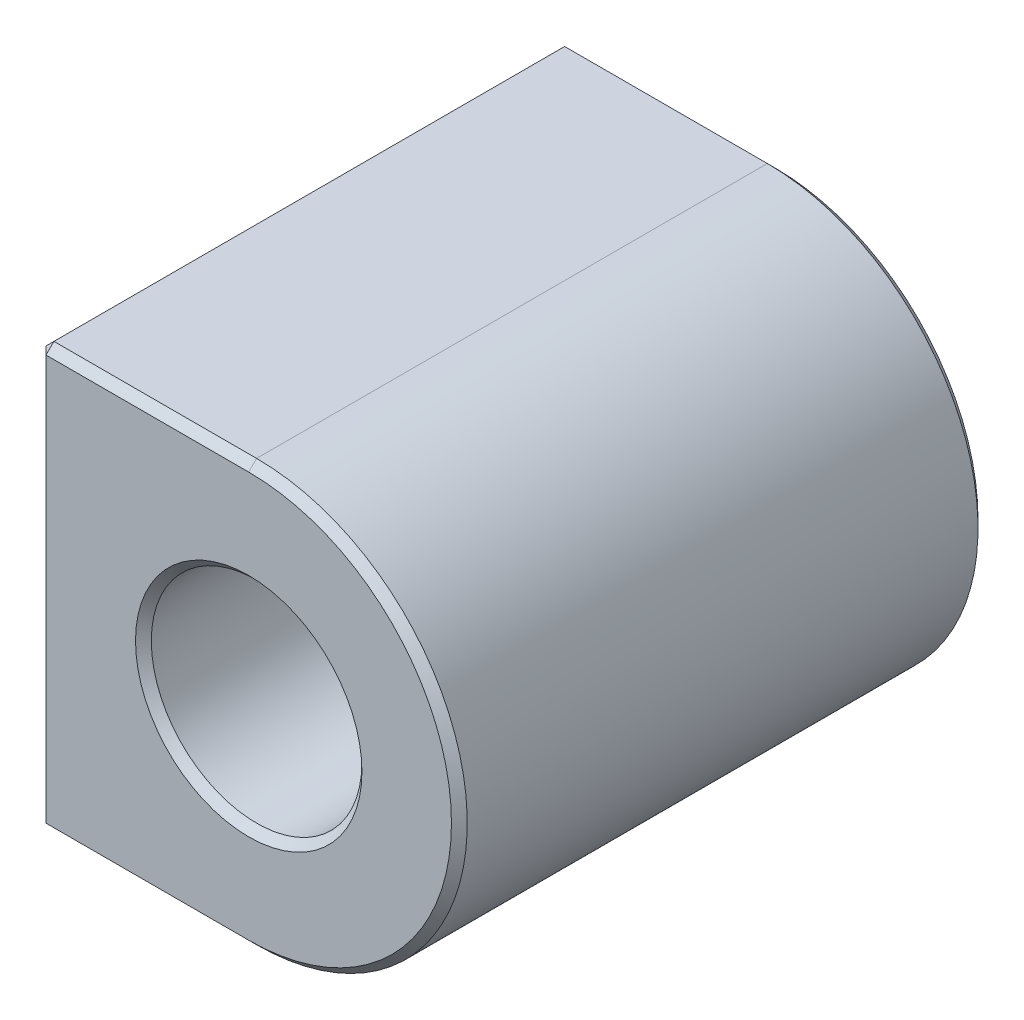
ISO-10303-21;
HEADER;
FILE_DESCRIPTION(('STEP AP214'),'2;1');
FILE_NAME('part.step','',(''),(''),'','','');
FILE_SCHEMA(('AUTOMOTIVE_DESIGN { 1 0 10303 214 1 1 1 1 }'));
ENDSEC;
DATA;
#1=APPLICATION_CONTEXT('core data for automotive mechanical design processes');
#2=APPLICATION_PROTOCOL_DEFINITION('international standard','automotive_design',2000,#1);
#3=PRODUCT_CONTEXT('',#1,'mechanical');
#4=PRODUCT('Part','Part','',(#3));
#5=PRODUCT_RELATED_PRODUCT_CATEGORY('part','',(#4));
#6=PRODUCT_DEFINITION_FORMATION('','',#4);
#7=PRODUCT_DEFINITION_CONTEXT('part definition',#1,'design');
#8=PRODUCT_DEFINITION('design','',#6,#7);
#9=PRODUCT_DEFINITION_SHAPE('','',#8);
#10=(LENGTH_UNIT() NAMED_UNIT(*) SI_UNIT(.MILLI.,.METRE.));
#11=(NAMED_UNIT(*) PLANE_ANGLE_UNIT() SI_UNIT($,.RADIAN.));
#12=(NAMED_UNIT(*) SI_UNIT($,.STERADIAN.) SOLID_ANGLE_UNIT());
#13=UNCERTAINTY_MEASURE_WITH_UNIT(LENGTH_MEASURE(1.E-05),#10,'distance_accuracy_value','');
#14=(GEOMETRIC_REPRESENTATION_CONTEXT(3) GLOBAL_UNCERTAINTY_ASSIGNED_CONTEXT((#13)) GLOBAL_UNIT_ASSIGNED_CONTEXT((#10,
#11,#12)) REPRESENTATION_CONTEXT('',''));
#15=CARTESIAN_POINT('',(0.,0.,0.));
#16=DIRECTION('',(0.,0.,1.));
#17=DIRECTION('',(1.,0.,0.));
#18=AXIS2_PLACEMENT_3D('',#15,#16,#17);
#19=CARTESIAN_POINT('',(0.,0.,5.));
#20=DIRECTION('',(0.,0.,1.));
#21=DIRECTION('',(1.,0.,0.));
#22=AXIS2_PLACEMENT_3D('',#19,#20,#21);
#23=PLANE('',#22);
#24=CARTESIAN_POINT('',(0.,0.,5.));
#25=DIRECTION('',(0.,0.,1.));
#26=DIRECTION('',(1.,0.,0.));
#27=AXIS2_PLACEMENT_3D('',#24,#25,#26);
#28=CIRCLE('',#27,2.15);
#29=CARTESIAN_POINT('',(2.15,0.,5.));
#30=VERTEX_POINT('',#29);
#31=EDGE_CURVE('E236',#30,#30,#28,.F.);
#32=ORIENTED_EDGE('',*,*,#31,.T.);
#33=EDGE_LOOP('',(#32));
#34=FACE_BOUND('',#33,.T.);
#35=DIRECTION('',(1.,0.,0.));
#36=VECTOR('',#35,1.);
#37=CARTESIAN_POINT('',(0.,-3.85,5.));
#38=LINE('',#37,#36);
#39=CARTESIAN_POINT('',(-3.85,-3.85,5.));
#40=VERTEX_POINT('',#39);
#41=CARTESIAN_POINT('',(0.,-3.85,5.));
#42=VERTEX_POINT('',#41);
#43=EDGE_CURVE('E133',#40,#42,#38,.T.);
#44=ORIENTED_EDGE('',*,*,#43,.T.);
#45=CARTESIAN_POINT('',(0.,0.,5.));
#46=DIRECTION('',(0.,0.,1.));
#47=DIRECTION('',(1.,0.,0.));
#48=AXIS2_PLACEMENT_3D('',#45,#46,#47);
#49=CIRCLE('',#48,3.85);
#50=CARTESIAN_POINT('',(0.,3.85,5.));
#51=VERTEX_POINT('',#50);
#52=EDGE_CURVE('E128',#42,#51,#49,.T.);
#53=ORIENTED_EDGE('',*,*,#52,.T.);
#54=DIRECTION('',(-1.,0.,0.));
#55=VECTOR('',#54,1.);
#56=CARTESIAN_POINT('',(-4.,3.85,5.));
#57=LINE('',#56,#55);
#58=CARTESIAN_POINT('',(-3.85,3.85,5.));
#59=VERTEX_POINT('',#58);
#60=EDGE_CURVE('E123',#51,#59,#57,.T.);
#61=ORIENTED_EDGE('',*,*,#60,.T.);
#62=DIRECTION('',(0.,-1.,0.));
#63=VECTOR('',#62,1.);
#64=CARTESIAN_POINT('',(-3.85,-4.,5.));
#65=LINE('',#64,#63);
#66=EDGE_CURVE('E125',#59,#40,#65,.T.);
#67=ORIENTED_EDGE('',*,*,#66,.T.);
#68=EDGE_LOOP('',(#44,#53,#61,#67));
#69=FACE_BOUND('',#68,.T.);
#70=ADVANCED_FACE('F45',(#34,#69),#23,.T.);
#71=CARTESIAN_POINT('',(0.,0.,-5.));
#72=DIRECTION('',(0.,0.,1.));
#73=DIRECTION('',(1.,0.,0.));
#74=AXIS2_PLACEMENT_3D('',#71,#72,#73);
#75=PLANE('',#74);
#76=CARTESIAN_POINT('',(0.,0.,-5.));
#77=DIRECTION('',(0.,0.,1.));
#78=DIRECTION('',(1.,0.,0.));
#79=AXIS2_PLACEMENT_3D('',#76,#77,#78);
#80=CIRCLE('',#79,2.15);
#81=CARTESIAN_POINT('',(2.15,0.,-5.));
#82=VERTEX_POINT('',#81);
#83=EDGE_CURVE('E253',#82,#82,#80,.T.);
#84=ORIENTED_EDGE('',*,*,#83,.T.);
#85=EDGE_LOOP('',(#84));
#86=FACE_BOUND('',#85,.T.);
#87=DIRECTION('',(1.,0.,0.));
#88=VECTOR('',#87,1.);
#89=CARTESIAN_POINT('',(0.,3.85,-5.));
#90=LINE('',#89,#88);
#91=CARTESIAN_POINT('',(-3.85,3.85,-5.));
#92=VERTEX_POINT('',#91);
#93=CARTESIAN_POINT('',(0.,3.85,-5.));
#94=VERTEX_POINT('',#93);
#95=EDGE_CURVE('E243',#92,#94,#90,.T.);
#96=ORIENTED_EDGE('',*,*,#95,.T.);
#97=CARTESIAN_POINT('',(0.,0.,-5.));
#98=DIRECTION('',(0.,0.,1.));
#99=DIRECTION('',(1.,0.,0.));
#100=AXIS2_PLACEMENT_3D('',#97,#98,#99);
#101=CIRCLE('',#100,3.85);
#102=CARTESIAN_POINT('',(0.,-3.85,-5.));
#103=VERTEX_POINT('',#102);
#104=EDGE_CURVE('E249',#94,#103,#101,.F.);
#105=ORIENTED_EDGE('',*,*,#104,.T.);
#106=DIRECTION('',(-1.,0.,0.));
#107=VECTOR('',#106,1.);
#108=CARTESIAN_POINT('',(0.,-3.85,-5.));
#109=LINE('',#108,#107);
#110=CARTESIAN_POINT('',(-3.85,-3.85,-5.));
#111=VERTEX_POINT('',#110);
#112=EDGE_CURVE('E246',#103,#111,#109,.T.);
#113=ORIENTED_EDGE('',*,*,#112,.T.);
#114=DIRECTION('',(0.,1.,0.));
#115=VECTOR('',#114,1.);
#116=CARTESIAN_POINT('',(-3.85,0.,-5.));
#117=LINE('',#116,#115);
#118=EDGE_CURVE('E240',#111,#92,#117,.T.);
#119=ORIENTED_EDGE('',*,*,#118,.T.);
#120=EDGE_LOOP('',(#96,#105,#113,#119));
#121=FACE_BOUND('',#120,.T.);
#122=ADVANCED_FACE('F321',(#86,#121),#75,.F.);
#123=CARTESIAN_POINT('',(0.,0.,5.));
#124=DIRECTION('',(0.,0.,-1.));
#125=DIRECTION('',(-1.,0.,0.));
#126=AXIS2_PLACEMENT_3D('',#123,#124,#125);
#127=CYLINDRICAL_SURFACE('',#126,4.);
#128=DIRECTION('',(0.,0.,-1.));
#129=VECTOR('',#128,1.);
#130=CARTESIAN_POINT('',(0.,4.,5.));
#131=LINE('',#130,#129);
#132=CARTESIAN_POINT('',(0.,4.,4.85));
#133=VERTEX_POINT('',#132);
#134=CARTESIAN_POINT('',(0.,4.,-4.85));
#135=VERTEX_POINT('',#134);
#136=EDGE_CURVE('E215',#133,#135,#131,.T.);
#137=ORIENTED_EDGE('',*,*,#136,.F.);
#138=CARTESIAN_POINT('',(0.,0.,4.85));
#139=DIRECTION('',(0.,0.,1.));
#140=DIRECTION('',(1.,0.,0.));
#141=AXIS2_PLACEMENT_3D('',#138,#139,#140);
#142=CIRCLE('',#141,4.);
#143=CARTESIAN_POINT('',(0.,-4.,4.85));
#144=VERTEX_POINT('',#143);
#145=EDGE_CURVE('E260',#133,#144,#142,.F.);
#146=ORIENTED_EDGE('',*,*,#145,.T.);
#147=DIRECTION('',(0.,0.,-1.));
#148=VECTOR('',#147,1.);
#149=CARTESIAN_POINT('',(0.,-4.,5.));
#150=LINE('',#149,#148);
#151=CARTESIAN_POINT('',(0.,-4.,-4.85));
#152=VERTEX_POINT('',#151);
#153=EDGE_CURVE('E209',#144,#152,#150,.T.);
#154=ORIENTED_EDGE('',*,*,#153,.T.);
#155=CARTESIAN_POINT('',(0.,0.,-4.85));
#156=DIRECTION('',(0.,0.,1.));
#157=DIRECTION('',(1.,0.,0.));
#158=AXIS2_PLACEMENT_3D('',#155,#156,#157);
#159=CIRCLE('',#158,4.);
#160=EDGE_CURVE('E257',#152,#135,#159,.T.);
#161=ORIENTED_EDGE('',*,*,#160,.T.);
#162=EDGE_LOOP('',(#137,#146,#154,#161));
#163=FACE_BOUND('',#162,.T.);
#164=ADVANCED_FACE('F293',(#163),#127,.T.);
#165=CARTESIAN_POINT('',(0.,4.,5.));
#166=DIRECTION('',(0.,-1.,0.));
#167=DIRECTION('',(1.,0.,0.));
#168=AXIS2_PLACEMENT_3D('',#165,#166,#167);
#169=PLANE('',#168);
#170=DIRECTION('',(0.,0.,1.));
#171=VECTOR('',#170,1.);
#172=CARTESIAN_POINT('',(-3.85,4.,5.));
#173=LINE('',#172,#171);
#174=CARTESIAN_POINT('',(-3.85,4.,-4.85));
#175=VERTEX_POINT('',#174);
#176=CARTESIAN_POINT('',(-3.85,4.,4.85));
#177=VERTEX_POINT('',#176);
#178=EDGE_CURVE('E272',#175,#177,#173,.T.);
#179=ORIENTED_EDGE('',*,*,#178,.T.);
#180=DIRECTION('',(1.,0.,0.));
#181=VECTOR('',#180,1.);
#182=CARTESIAN_POINT('',(0.,4.,4.85));
#183=LINE('',#182,#181);
#184=EDGE_CURVE('E157',#177,#133,#183,.T.);
#185=ORIENTED_EDGE('',*,*,#184,.T.);
#186=ORIENTED_EDGE('',*,*,#136,.T.);
#187=DIRECTION('',(-1.,0.,0.));
#188=VECTOR('',#187,1.);
#189=CARTESIAN_POINT('',(0.,4.,-4.85));
#190=LINE('',#189,#188);
#191=EDGE_CURVE('E275',#135,#175,#190,.T.);
#192=ORIENTED_EDGE('',*,*,#191,.T.);
#193=EDGE_LOOP('',(#179,#185,#186,#192));
#194=FACE_BOUND('',#193,.T.);
#195=ADVANCED_FACE('F337',(#194),#169,.F.);
#196=CARTESIAN_POINT('',(-4.,4.,5.));
#197=DIRECTION('',(1.,0.,0.));
#198=DIRECTION('',(0.,1.,0.));
#199=AXIS2_PLACEMENT_3D('',#196,#197,#198);
#200=PLANE('',#199);
#201=DIRECTION('',(0.,1.,0.));
#202=VECTOR('',#201,1.);
#203=CARTESIAN_POINT('',(-4.,4.,4.85));
#204=LINE('',#203,#202);
#205=CARTESIAN_POINT('',(-4.,-3.85,4.85));
#206=VERTEX_POINT('',#205);
#207=CARTESIAN_POINT('',(-4.,3.85,4.85));
#208=VERTEX_POINT('',#207);
#209=EDGE_CURVE('E56',#206,#208,#204,.T.);
#210=ORIENTED_EDGE('',*,*,#209,.T.);
#211=DIRECTION('',(0.,0.,-1.));
#212=VECTOR('',#211,1.);
#213=CARTESIAN_POINT('',(-4.,3.85,5.));
#214=LINE('',#213,#212);
#215=CARTESIAN_POINT('',(-4.,3.85,-4.85));
#216=VERTEX_POINT('',#215);
#217=EDGE_CURVE('E11',#208,#216,#214,.T.);
#218=ORIENTED_EDGE('',*,*,#217,.T.);
#219=DIRECTION('',(0.,-1.,0.));
#220=VECTOR('',#219,1.);
#221=CARTESIAN_POINT('',(-4.,4.,-4.85));
#222=LINE('',#221,#220);
#223=CARTESIAN_POINT('',(-4.,-3.85,-4.85));
#224=VERTEX_POINT('',#223);
#225=EDGE_CURVE('E280',#216,#224,#222,.T.);
#226=ORIENTED_EDGE('',*,*,#225,.T.);
#227=DIRECTION('',(0.,0.,1.));
#228=VECTOR('',#227,1.);
#229=CARTESIAN_POINT('',(-4.,-3.85,5.));
#230=LINE('',#229,#228);
#231=EDGE_CURVE('E67',#224,#206,#230,.T.);
#232=ORIENTED_EDGE('',*,*,#231,.T.);
#233=EDGE_LOOP('',(#210,#218,#226,#232));
#234=FACE_BOUND('',#233,.T.);
#235=ADVANCED_FACE('F334',(#234),#200,.F.);
#236=CARTESIAN_POINT('',(0.,-4.,5.));
#237=DIRECTION('',(0.,1.,0.));
#238=DIRECTION('',(-1.,0.,0.));
#239=AXIS2_PLACEMENT_3D('',#236,#237,#238);
#240=PLANE('',#239);
#241=ORIENTED_EDGE('',*,*,#153,.F.);
#242=DIRECTION('',(-1.,0.,0.));
#243=VECTOR('',#242,1.);
#244=CARTESIAN_POINT('',(-4.,-4.,4.85));
#245=LINE('',#244,#243);
#246=CARTESIAN_POINT('',(-3.85,-4.,4.85));
#247=VERTEX_POINT('',#246);
#248=EDGE_CURVE('E269',#144,#247,#245,.T.);
#249=ORIENTED_EDGE('',*,*,#248,.T.);
#250=DIRECTION('',(0.,0.,-1.));
#251=VECTOR('',#250,1.);
#252=CARTESIAN_POINT('',(-3.85,-4.,5.));
#253=LINE('',#252,#251);
#254=CARTESIAN_POINT('',(-3.85,-4.,-4.85));
#255=VERTEX_POINT('',#254);
#256=EDGE_CURVE('E263',#247,#255,#253,.T.);
#257=ORIENTED_EDGE('',*,*,#256,.T.);
#258=DIRECTION('',(1.,0.,0.));
#259=VECTOR('',#258,1.);
#260=CARTESIAN_POINT('',(0.,-4.,-4.85));
#261=LINE('',#260,#259);
#262=EDGE_CURVE('E266',#255,#152,#261,.T.);
#263=ORIENTED_EDGE('',*,*,#262,.T.);
#264=EDGE_LOOP('',(#241,#249,#257,#263));
#265=FACE_BOUND('',#264,.T.);
#266=ADVANCED_FACE('F295',(#265),#240,.F.);
#267=CARTESIAN_POINT('',(0.,0.,5.));
#268=DIRECTION('',(0.,0.,-1.));
#269=DIRECTION('',(-1.,0.,0.));
#270=AXIS2_PLACEMENT_3D('',#267,#268,#269);
#271=CYLINDRICAL_SURFACE('',#270,2.);
#272=CARTESIAN_POINT('',(0.,0.,4.85));
#273=DIRECTION('',(0.,0.,1.));
#274=DIRECTION('',(1.,0.,0.));
#275=AXIS2_PLACEMENT_3D('',#272,#273,#274);
#276=CIRCLE('',#275,2.);
#277=CARTESIAN_POINT('',(2.,0.,4.85));
#278=VERTEX_POINT('',#277);
#279=EDGE_CURVE('E145',#278,#278,#276,.T.);
#280=ORIENTED_EDGE('',*,*,#279,.T.);
#281=EDGE_LOOP('',(#280));
#282=FACE_BOUND('',#281,.T.);
#283=CARTESIAN_POINT('',(0.,0.,-4.85));
#284=DIRECTION('',(0.,0.,1.));
#285=DIRECTION('',(1.,0.,0.));
#286=AXIS2_PLACEMENT_3D('',#283,#284,#285);
#287=CIRCLE('',#286,2.);
#288=CARTESIAN_POINT('',(2.,0.,-4.85));
#289=VERTEX_POINT('',#288);
#290=EDGE_CURVE('E223',#289,#289,#287,.F.);
#291=ORIENTED_EDGE('',*,*,#290,.T.);
#292=EDGE_LOOP('',(#291));
#293=FACE_BOUND('',#292,.T.);
#294=ADVANCED_FACE('F330',(#282,#293),#271,.F.);
#295=CARTESIAN_POINT('',(0.,0.,4.85));
#296=DIRECTION('',(0.,0.,1.));
#297=DIRECTION('',(1.,0.,0.));
#298=AXIS2_PLACEMENT_3D('',#295,#296,#297);
#299=CONICAL_SURFACE('',#298,2.,0.785398163397451);
#300=ORIENTED_EDGE('',*,*,#31,.F.);
#301=EDGE_LOOP('',(#300));
#302=FACE_BOUND('',#301,.T.);
#303=ORIENTED_EDGE('',*,*,#279,.F.);
#304=EDGE_LOOP('',(#303));
#305=FACE_BOUND('',#304,.T.);
#306=ADVANCED_FACE('F344',(#302,#305),#299,.F.);
#307=CARTESIAN_POINT('',(0.,0.,-5.));
#308=DIRECTION('',(0.,0.,-1.));
#309=DIRECTION('',(-1.,0.,0.));
#310=AXIS2_PLACEMENT_3D('',#307,#308,#309);
#311=CONICAL_SURFACE('',#310,2.15,0.785398163397448);
#312=ORIENTED_EDGE('',*,*,#290,.F.);
#313=EDGE_LOOP('',(#312));
#314=FACE_BOUND('',#313,.T.);
#315=ORIENTED_EDGE('',*,*,#83,.F.);
#316=EDGE_LOOP('',(#315));
#317=FACE_BOUND('',#316,.T.);
#318=ADVANCED_FACE('F350',(#314,#317),#311,.F.);
#319=CARTESIAN_POINT('',(0.,0.,-4.85));
#320=DIRECTION('',(0.,0.,1.));
#321=DIRECTION('',(1.,0.,0.));
#322=AXIS2_PLACEMENT_3D('',#319,#320,#321);
#323=CONICAL_SURFACE('',#322,4.,0.785398163397454);
#324=DIRECTION('',(0.,-0.707106781186552,-0.707106781186543));
#325=VECTOR('',#324,1.);
#326=CARTESIAN_POINT('',(0.,4.,-4.85));
#327=LINE('',#326,#325);
#328=EDGE_CURVE('E200',#135,#94,#327,.T.);
#329=ORIENTED_EDGE('',*,*,#328,.F.);
#330=ORIENTED_EDGE('',*,*,#160,.F.);
#331=DIRECTION('',(0.,-0.707106781186552,0.707106781186543));
#332=VECTOR('',#331,1.);
#333=CARTESIAN_POINT('',(0.,-3.85,-5.));
#334=LINE('',#333,#332);
#335=EDGE_CURVE('E50',#103,#152,#334,.T.);
#336=ORIENTED_EDGE('',*,*,#335,.F.);
#337=ORIENTED_EDGE('',*,*,#104,.F.);
#338=EDGE_LOOP('',(#329,#330,#336,#337));
#339=FACE_BOUND('',#338,.T.);
#340=ADVANCED_FACE('F48',(#339),#323,.T.);
#341=CARTESIAN_POINT('',(0.,-4.,-4.85));
#342=DIRECTION('',(0.,0.707106781186543,0.707106781186552));
#343=DIRECTION('',(1.,0.,0.));
#344=AXIS2_PLACEMENT_3D('',#341,#342,#343);
#345=PLANE('',#344);
#346=ORIENTED_EDGE('',*,*,#335,.T.);
#347=ORIENTED_EDGE('',*,*,#262,.F.);
#348=DIRECTION('',(0.,0.707106781186552,-0.707106781186543));
#349=VECTOR('',#348,1.);
#350=CARTESIAN_POINT('',(-3.85,-3.85,-5.));
#351=LINE('',#350,#349);
#352=EDGE_CURVE('E197',#111,#255,#351,.F.);
#353=ORIENTED_EDGE('',*,*,#352,.F.);
#354=ORIENTED_EDGE('',*,*,#112,.F.);
#355=EDGE_LOOP('',(#346,#347,#353,#354));
#356=FACE_BOUND('',#355,.T.);
#357=ADVANCED_FACE('F298',(#356),#345,.F.);
#358=CARTESIAN_POINT('',(-4.,4.,-4.85));
#359=DIRECTION('',(0.707106781186543,0.,0.707106781186552));
#360=DIRECTION('',(0.,-1.,0.));
#361=AXIS2_PLACEMENT_3D('',#358,#359,#360);
#362=PLANE('',#361);
#363=DIRECTION('',(0.707106781186552,0.,-0.707106781186543));
#364=VECTOR('',#363,1.);
#365=CARTESIAN_POINT('',(-3.925,3.85,-4.925));
#366=LINE('',#365,#364);
#367=EDGE_CURVE('E189',#92,#216,#366,.F.);
#368=ORIENTED_EDGE('',*,*,#367,.F.);
#369=ORIENTED_EDGE('',*,*,#118,.F.);
#370=DIRECTION('',(-0.707106781186552,0.,0.707106781186544));
#371=VECTOR('',#370,1.);
#372=CARTESIAN_POINT('',(-3.85,-3.85,-5.));
#373=LINE('',#372,#371);
#374=EDGE_CURVE('E193',#224,#111,#373,.F.);
#375=ORIENTED_EDGE('',*,*,#374,.F.);
#376=ORIENTED_EDGE('',*,*,#225,.F.);
#377=EDGE_LOOP('',(#368,#369,#375,#376));
#378=FACE_BOUND('',#377,.T.);
#379=ADVANCED_FACE('F405',(#378),#362,.F.);
#380=CARTESIAN_POINT('',(0.,4.,-4.85));
#381=DIRECTION('',(0.,-0.707106781186543,0.707106781186552));
#382=DIRECTION('',(-1.,0.,0.));
#383=AXIS2_PLACEMENT_3D('',#380,#381,#382);
#384=PLANE('',#383);
#385=ORIENTED_EDGE('',*,*,#328,.T.);
#386=ORIENTED_EDGE('',*,*,#95,.F.);
#387=DIRECTION('',(0.,0.707106781186552,0.707106781186543));
#388=VECTOR('',#387,1.);
#389=CARTESIAN_POINT('',(-3.85,4.,-4.85));
#390=LINE('',#389,#388);
#391=EDGE_CURVE('E185',#175,#92,#390,.F.);
#392=ORIENTED_EDGE('',*,*,#391,.F.);
#393=ORIENTED_EDGE('',*,*,#191,.F.);
#394=EDGE_LOOP('',(#385,#386,#392,#393));
#395=FACE_BOUND('',#394,.T.);
#396=ADVANCED_FACE('F400',(#395),#384,.F.);
#397=CARTESIAN_POINT('',(-3.85,-3.85,-5.));
#398=DIRECTION('',(-0.577350269189621,-0.577350269189625,-0.577350269189631));
#399=DIRECTION('',(0.,0.707106781186552,-0.707106781186543));
#400=AXIS2_PLACEMENT_3D('',#397,#398,#399);
#401=PLANE('',#400);
#402=ORIENTED_EDGE('',*,*,#374,.T.);
#403=ORIENTED_EDGE('',*,*,#352,.T.);
#404=DIRECTION('',(0.70710678118655,-0.707106781186545,0.));
#405=VECTOR('',#404,1.);
#406=CARTESIAN_POINT('',(-3.925,-3.925,-4.85));
#407=LINE('',#406,#405);
#408=EDGE_CURVE('E181',#224,#255,#407,.T.);
#409=ORIENTED_EDGE('',*,*,#408,.F.);
#410=EDGE_LOOP('',(#402,#403,#409));
#411=FACE_BOUND('',#410,.T.);
#412=ADVANCED_FACE('F301',(#411),#401,.T.);
#413=CARTESIAN_POINT('',(-3.85,4.,-4.85));
#414=DIRECTION('',(-0.577350269189619,0.577350269189626,-0.577350269189633));
#415=DIRECTION('',(0.,0.707106781186552,0.707106781186543));
#416=AXIS2_PLACEMENT_3D('',#413,#414,#415);
#417=PLANE('',#416);
#418=ORIENTED_EDGE('',*,*,#391,.T.);
#419=ORIENTED_EDGE('',*,*,#367,.T.);
#420=DIRECTION('',(-0.707106781186552,-0.707106781186543,0.));
#421=VECTOR('',#420,1.);
#422=CARTESIAN_POINT('',(-3.85,4.,-4.85));
#423=LINE('',#422,#421);
#424=EDGE_CURVE('E178',#175,#216,#423,.T.);
#425=ORIENTED_EDGE('',*,*,#424,.F.);
#426=EDGE_LOOP('',(#418,#419,#425));
#427=FACE_BOUND('',#426,.T.);
#428=ADVANCED_FACE('F391',(#427),#417,.T.);
#429=CARTESIAN_POINT('',(-3.85,-4.,5.));
#430=DIRECTION('',(0.707106781186546,0.70710678118655,0.));
#431=DIRECTION('',(0.,0.,-1.));
#432=AXIS2_PLACEMENT_3D('',#429,#430,#431);
#433=PLANE('',#432);
#434=ORIENTED_EDGE('',*,*,#408,.T.);
#435=ORIENTED_EDGE('',*,*,#256,.F.);
#436=DIRECTION('',(-0.707106781186549,0.707106781186545,0.));
#437=VECTOR('',#436,1.);
#438=CARTESIAN_POINT('',(-3.85,-4.,4.85));
#439=LINE('',#438,#437);
#440=EDGE_CURVE('E174',#206,#247,#439,.F.);
#441=ORIENTED_EDGE('',*,*,#440,.F.);
#442=ORIENTED_EDGE('',*,*,#231,.F.);
#443=EDGE_LOOP('',(#434,#435,#441,#442));
#444=FACE_BOUND('',#443,.T.);
#445=ADVANCED_FACE('F304',(#444),#433,.F.);
#446=CARTESIAN_POINT('',(-3.85,0.,5.));
#447=DIRECTION('',(-0.707106781186543,0.,0.707106781186552));
#448=DIRECTION('',(0.,1.,0.));
#449=AXIS2_PLACEMENT_3D('',#446,#447,#448);
#450=PLANE('',#449);
#451=DIRECTION('',(0.707106781186552,0.,0.707106781186543));
#452=VECTOR('',#451,1.);
#453=CARTESIAN_POINT('',(-3.85,3.85,5.));
#454=LINE('',#453,#452);
#455=EDGE_CURVE('E139',#208,#59,#454,.T.);
#456=ORIENTED_EDGE('',*,*,#455,.F.);
#457=ORIENTED_EDGE('',*,*,#209,.F.);
#458=DIRECTION('',(-0.707106781186552,0.,-0.707106781186543));
#459=VECTOR('',#458,1.);
#460=CARTESIAN_POINT('',(-3.925,-3.85,4.925));
#461=LINE('',#460,#459);
#462=EDGE_CURVE('E142',#40,#206,#461,.T.);
#463=ORIENTED_EDGE('',*,*,#462,.F.);
#464=ORIENTED_EDGE('',*,*,#66,.F.);
#465=EDGE_LOOP('',(#456,#457,#463,#464));
#466=FACE_BOUND('',#465,.T.);
#467=ADVANCED_FACE('F138',(#466),#450,.T.);
#468=CARTESIAN_POINT('',(-4.,3.85,5.));
#469=DIRECTION('',(0.707106781186543,-0.707106781186552,0.));
#470=DIRECTION('',(0.,0.,-1.));
#471=AXIS2_PLACEMENT_3D('',#468,#469,#470);
#472=PLANE('',#471);
#473=ORIENTED_EDGE('',*,*,#424,.T.);
#474=ORIENTED_EDGE('',*,*,#217,.F.);
#475=DIRECTION('',(0.707106781186552,0.707106781186543,0.));
#476=VECTOR('',#475,1.);
#477=CARTESIAN_POINT('',(-3.925,3.925,4.85));
#478=LINE('',#477,#476);
#479=EDGE_CURVE('E153',#177,#208,#478,.F.);
#480=ORIENTED_EDGE('',*,*,#479,.F.);
#481=ORIENTED_EDGE('',*,*,#178,.F.);
#482=EDGE_LOOP('',(#473,#474,#480,#481));
#483=FACE_BOUND('',#482,.T.);
#484=ADVANCED_FACE('F378',(#483),#472,.F.);
#485=CARTESIAN_POINT('',(-3.85,-4.,4.85));
#486=DIRECTION('',(-0.577350269189621,-0.577350269189631,0.577350269189625));
#487=DIRECTION('',(0.,-0.707106781186543,-0.707106781186552));
#488=AXIS2_PLACEMENT_3D('',#485,#486,#487);
#489=PLANE('',#488);
#490=ORIENTED_EDGE('',*,*,#462,.T.);
#491=ORIENTED_EDGE('',*,*,#440,.T.);
#492=DIRECTION('',(0.,0.707106781186543,0.707106781186552));
#493=VECTOR('',#492,1.);
#494=CARTESIAN_POINT('',(-3.85,-4.,4.85));
#495=LINE('',#494,#493);
#496=EDGE_CURVE('E159',#40,#247,#495,.F.);
#497=ORIENTED_EDGE('',*,*,#496,.F.);
#498=EDGE_LOOP('',(#490,#491,#497));
#499=FACE_BOUND('',#498,.T.);
#500=ADVANCED_FACE('F307',(#499),#489,.T.);
#501=CARTESIAN_POINT('',(-3.85,3.85,5.));
#502=DIRECTION('',(-0.577350269189619,0.577350269189632,0.577350269189626));
#503=DIRECTION('',(0.,-0.707106781186543,0.707106781186552));
#504=AXIS2_PLACEMENT_3D('',#501,#502,#503);
#505=PLANE('',#504);
#506=ORIENTED_EDGE('',*,*,#479,.T.);
#507=ORIENTED_EDGE('',*,*,#455,.T.);
#508=DIRECTION('',(0.,0.707106781186543,-0.707106781186552));
#509=VECTOR('',#508,1.);
#510=CARTESIAN_POINT('',(-3.85,3.85,5.));
#511=LINE('',#510,#509);
#512=EDGE_CURVE('E150',#177,#59,#511,.F.);
#513=ORIENTED_EDGE('',*,*,#512,.F.);
#514=EDGE_LOOP('',(#506,#507,#513));
#515=FACE_BOUND('',#514,.T.);
#516=ADVANCED_FACE('F149',(#515),#505,.T.);
#517=CARTESIAN_POINT('',(0.,-3.85,5.));
#518=DIRECTION('',(0.,-0.707106781186552,0.707106781186543));
#519=DIRECTION('',(-1.,0.,0.));
#520=AXIS2_PLACEMENT_3D('',#517,#518,#519);
#521=PLANE('',#520);
#522=ORIENTED_EDGE('',*,*,#496,.T.);
#523=ORIENTED_EDGE('',*,*,#248,.F.);
#524=DIRECTION('',(0.,-0.707106781186543,-0.707106781186552));
#525=VECTOR('',#524,1.);
#526=CARTESIAN_POINT('',(0.,-3.85,5.));
#527=LINE('',#526,#525);
#528=EDGE_CURVE('E160',#42,#144,#527,.T.);
#529=ORIENTED_EDGE('',*,*,#528,.F.);
#530=ORIENTED_EDGE('',*,*,#43,.F.);
#531=EDGE_LOOP('',(#522,#523,#529,#530));
#532=FACE_BOUND('',#531,.T.);
#533=ADVANCED_FACE('F310',(#532),#521,.T.);
#534=CARTESIAN_POINT('',(0.,3.85,5.));
#535=DIRECTION('',(0.,0.707106781186552,0.707106781186543));
#536=DIRECTION('',(1.,0.,0.));
#537=AXIS2_PLACEMENT_3D('',#534,#535,#536);
#538=PLANE('',#537);
#539=ORIENTED_EDGE('',*,*,#512,.T.);
#540=ORIENTED_EDGE('',*,*,#60,.F.);
#541=DIRECTION('',(0.,-0.707106781186543,0.707106781186552));
#542=VECTOR('',#541,1.);
#543=CARTESIAN_POINT('',(0.,4.,4.85));
#544=LINE('',#543,#542);
#545=EDGE_CURVE('E166',#133,#51,#544,.T.);
#546=ORIENTED_EDGE('',*,*,#545,.F.);
#547=ORIENTED_EDGE('',*,*,#184,.F.);
#548=EDGE_LOOP('',(#539,#540,#546,#547));
#549=FACE_BOUND('',#548,.T.);
#550=ADVANCED_FACE('F156',(#549),#538,.T.);
#551=CARTESIAN_POINT('',(0.,0.,5.));
#552=DIRECTION('',(0.,0.,-1.));
#553=DIRECTION('',(-1.,0.,0.));
#554=AXIS2_PLACEMENT_3D('',#551,#552,#553);
#555=CONICAL_SURFACE('',#554,3.85,0.785398163397443);
#556=ORIENTED_EDGE('',*,*,#528,.T.);
#557=ORIENTED_EDGE('',*,*,#145,.F.);
#558=ORIENTED_EDGE('',*,*,#545,.T.);
#559=ORIENTED_EDGE('',*,*,#52,.F.);
#560=EDGE_LOOP('',(#556,#557,#558,#559));
#561=FACE_BOUND('',#560,.T.);
#562=ADVANCED_FACE('F289',(#561),#555,.T.);
#563=CLOSED_SHELL('',(#70,#122,#164,#195,#235,#266,#294,#306,#318,#340,#357,#379,#396,#412,#428,
#445,#467,#484,#500,#516,#533,#550,#562));
#564=MANIFOLD_SOLID_BREP('B2',#563);
#565=ADVANCED_BREP_SHAPE_REPRESENTATION('',(#18,#564),#14);
#566=SHAPE_DEFINITION_REPRESENTATION(#9,#565);
ENDSEC;
END-ISO-10303-21;
